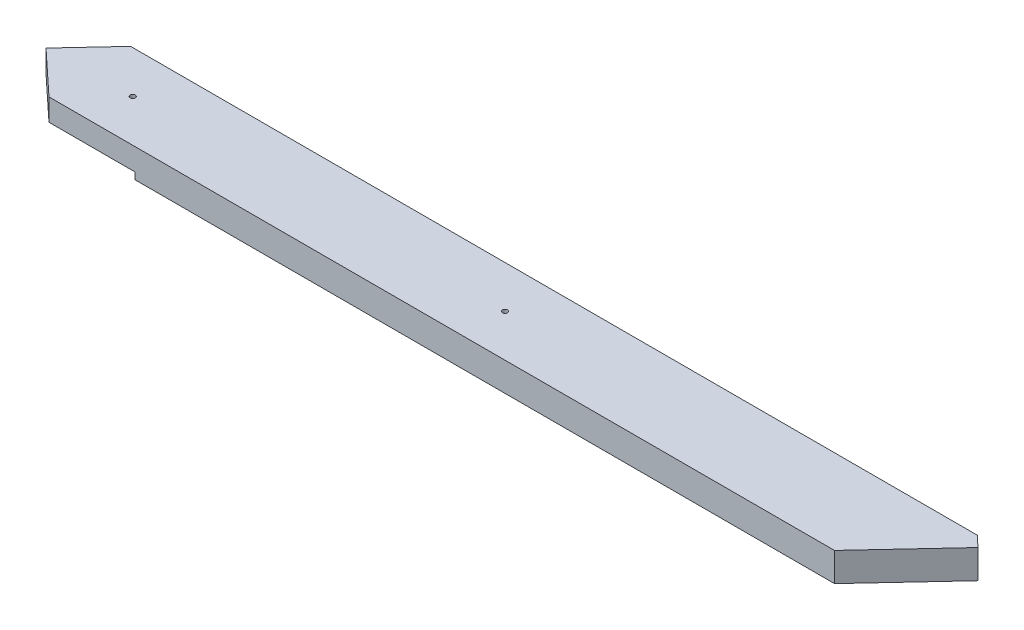
ISO-10303-21;
HEADER;
FILE_DESCRIPTION(('STEP AP214'),'2;1');
FILE_NAME('part.step','',(''),(''),'','','');
FILE_SCHEMA(('AUTOMOTIVE_DESIGN { 1 0 10303 214 1 1 1 1 }'));
ENDSEC;
DATA;
#1=APPLICATION_CONTEXT('core data for automotive mechanical design processes');
#2=APPLICATION_PROTOCOL_DEFINITION('international standard','automotive_design',2000,#1);
#3=PRODUCT_CONTEXT('',#1,'mechanical');
#4=PRODUCT('Part','Part','',(#3));
#5=PRODUCT_RELATED_PRODUCT_CATEGORY('part','',(#4));
#6=PRODUCT_DEFINITION_FORMATION('','',#4);
#7=PRODUCT_DEFINITION_CONTEXT('part definition',#1,'design');
#8=PRODUCT_DEFINITION('design','',#6,#7);
#9=PRODUCT_DEFINITION_SHAPE('','',#8);
#10=(LENGTH_UNIT() NAMED_UNIT(*) SI_UNIT(.MILLI.,.METRE.));
#11=(NAMED_UNIT(*) PLANE_ANGLE_UNIT() SI_UNIT($,.RADIAN.));
#12=(NAMED_UNIT(*) SI_UNIT($,.STERADIAN.) SOLID_ANGLE_UNIT());
#13=UNCERTAINTY_MEASURE_WITH_UNIT(LENGTH_MEASURE(1.E-05),#10,'distance_accuracy_value','');
#14=(GEOMETRIC_REPRESENTATION_CONTEXT(3) GLOBAL_UNCERTAINTY_ASSIGNED_CONTEXT((#13)) GLOBAL_UNIT_ASSIGNED_CONTEXT((#10,
#11,#12)) REPRESENTATION_CONTEXT('',''));
#15=CARTESIAN_POINT('',(0.,0.,0.));
#16=DIRECTION('',(0.,0.,1.));
#17=DIRECTION('',(1.,0.,0.));
#18=AXIS2_PLACEMENT_3D('',#15,#16,#17);
#19=CARTESIAN_POINT('',(-550.,34.,-50.));
#20=DIRECTION('',(0.,0.,1.));
#21=DIRECTION('',(1.,0.,0.));
#22=AXIS2_PLACEMENT_3D('',#19,#20,#21);
#23=PLANE('',#22);
#24=DIRECTION('',(-1.,0.,0.));
#25=VECTOR('',#24,1.);
#26=CARTESIAN_POINT('',(-550.,0.,-50.));
#27=LINE('',#26,#25);
#28=CARTESIAN_POINT('',(508.259057511825,0.,-50.));
#29=VERTEX_POINT('',#28);
#30=CARTESIAN_POINT('',(-294.288789872719,0.,-50.));
#31=VERTEX_POINT('',#30);
#32=EDGE_CURVE('E115',#29,#31,#27,.T.);
#33=ORIENTED_EDGE('',*,*,#32,.T.);
#34=DIRECTION('',(0.,1.,0.));
#35=VECTOR('',#34,1.);
#36=CARTESIAN_POINT('',(-294.288789872718,34.,-50.));
#37=LINE('',#36,#35);
#38=CARTESIAN_POINT('',(-294.288789872719,8.,-50.));
#39=VERTEX_POINT('',#38);
#40=EDGE_CURVE('E98',#31,#39,#37,.T.);
#41=ORIENTED_EDGE('',*,*,#40,.T.);
#42=DIRECTION('',(-1.,0.,0.));
#43=VECTOR('',#42,1.);
#44=CARTESIAN_POINT('',(-550.,8.,-50.));
#45=LINE('',#44,#43);
#46=CARTESIAN_POINT('',(-492.505745227102,8.,-50.));
#47=VERTEX_POINT('',#46);
#48=EDGE_CURVE('E166',#39,#47,#45,.T.);
#49=ORIENTED_EDGE('',*,*,#48,.T.);
#50=DIRECTION('',(0.,1.,0.));
#51=VECTOR('',#50,1.);
#52=CARTESIAN_POINT('',(-492.505745227102,0.,-50.));
#53=LINE('',#52,#51);
#54=CARTESIAN_POINT('',(-492.505745227102,34.,-50.));
#55=VERTEX_POINT('',#54);
#56=EDGE_CURVE('E149',#47,#55,#53,.T.);
#57=ORIENTED_EDGE('',*,*,#56,.T.);
#58=DIRECTION('',(-1.,0.,0.));
#59=VECTOR('',#58,1.);
#60=CARTESIAN_POINT('',(-550.,34.,-50.));
#61=LINE('',#60,#59);
#62=CARTESIAN_POINT('',(508.259057511825,34.,-50.));
#63=VERTEX_POINT('',#62);
#64=EDGE_CURVE('E123',#63,#55,#61,.T.);
#65=ORIENTED_EDGE('',*,*,#64,.F.);
#66=DIRECTION('',(0.,1.,0.));
#67=VECTOR('',#66,1.);
#68=CARTESIAN_POINT('',(508.259057511825,0.,-50.));
#69=LINE('',#68,#67);
#70=EDGE_CURVE('E120',#29,#63,#69,.T.);
#71=ORIENTED_EDGE('',*,*,#70,.F.);
#72=EDGE_LOOP('',(#33,#41,#49,#57,#65,#71));
#73=FACE_BOUND('',#72,.T.);
#74=ADVANCED_FACE('F33',(#73),#23,.F.);
#75=CARTESIAN_POINT('',(-550.,34.,50.));
#76=DIRECTION('',(0.,0.,-1.));
#77=DIRECTION('',(-1.,0.,0.));
#78=AXIS2_PLACEMENT_3D('',#75,#76,#77);
#79=PLANE('',#78);
#80=DIRECTION('',(1.,0.,0.));
#81=VECTOR('',#80,1.);
#82=CARTESIAN_POINT('',(-550.,8.,50.));
#83=LINE('',#82,#81);
#84=CARTESIAN_POINT('',(-489.02174353523,8.,50.));
#85=VERTEX_POINT('',#84);
#86=CARTESIAN_POINT('',(-387.494254772899,8.,50.));
#87=VERTEX_POINT('',#86);
#88=EDGE_CURVE('E47',#85,#87,#83,.T.);
#89=ORIENTED_EDGE('',*,*,#88,.T.);
#90=DIRECTION('',(0.,-1.,0.));
#91=VECTOR('',#90,1.);
#92=CARTESIAN_POINT('',(-387.494254772899,34.,50.));
#93=LINE('',#92,#91);
#94=CARTESIAN_POINT('',(-387.494254772899,0.,49.9999999999999));
#95=VERTEX_POINT('',#94);
#96=EDGE_CURVE('E108',#87,#95,#93,.T.);
#97=ORIENTED_EDGE('',*,*,#96,.T.);
#98=DIRECTION('',(1.,0.,0.));
#99=VECTOR('',#98,1.);
#100=CARTESIAN_POINT('',(-550.,0.,50.));
#101=LINE('',#100,#99);
#102=CARTESIAN_POINT('',(439.548903774699,0.,50.));
#103=VERTEX_POINT('',#102);
#104=EDGE_CURVE('E116',#95,#103,#101,.T.);
#105=ORIENTED_EDGE('',*,*,#104,.T.);
#106=DIRECTION('',(0.,1.,0.));
#107=VECTOR('',#106,1.);
#108=CARTESIAN_POINT('',(439.548903774699,0.,50.));
#109=LINE('',#108,#107);
#110=CARTESIAN_POINT('',(439.548903774699,34.,50.));
#111=VERTEX_POINT('',#110);
#112=EDGE_CURVE('E136',#103,#111,#109,.T.);
#113=ORIENTED_EDGE('',*,*,#112,.T.);
#114=DIRECTION('',(1.,0.,0.));
#115=VECTOR('',#114,1.);
#116=CARTESIAN_POINT('',(-550.,34.,50.));
#117=LINE('',#116,#115);
#118=CARTESIAN_POINT('',(-489.02174353523,34.,50.));
#119=VERTEX_POINT('',#118);
#120=EDGE_CURVE('E40',#119,#111,#117,.T.);
#121=ORIENTED_EDGE('',*,*,#120,.F.);
#122=DIRECTION('',(0.,1.,0.));
#123=VECTOR('',#122,1.);
#124=CARTESIAN_POINT('',(-489.02174353523,0.,50.));
#125=LINE('',#124,#123);
#126=EDGE_CURVE('E152',#85,#119,#125,.T.);
#127=ORIENTED_EDGE('',*,*,#126,.F.);
#128=EDGE_LOOP('',(#89,#97,#105,#113,#121,#127));
#129=FACE_BOUND('',#128,.T.);
#130=ADVANCED_FACE('F176',(#129),#79,.F.);
#131=CARTESIAN_POINT('',(0.,34.,0.));
#132=DIRECTION('',(0.,1.,0.));
#133=DIRECTION('',(0.,0.,1.));
#134=AXIS2_PLACEMENT_3D('',#131,#132,#133);
#135=PLANE('',#134);
#136=DIRECTION('',(0.681818181818181,0.,-0.73152167906505));
#137=VECTOR('',#136,1.);
#138=CARTESIAN_POINT('',(-540.762594459489,34.,1.77469935273535));
#139=LINE('',#138,#137);
#140=CARTESIAN_POINT('',(-540.762594459489,34.,1.77469935273535));
#141=VERTEX_POINT('',#140);
#142=EDGE_CURVE('E155',#141,#55,#139,.T.);
#143=ORIENTED_EDGE('',*,*,#142,.F.);
#144=DIRECTION('',(-0.73152167906505,0.,-0.681818181818181));
#145=VECTOR('',#144,1.);
#146=CARTESIAN_POINT('',(-489.02174353523,34.,50.));
#147=LINE('',#146,#145);
#148=EDGE_CURVE('E107',#119,#141,#147,.T.);
#149=ORIENTED_EDGE('',*,*,#148,.F.);
#150=ORIENTED_EDGE('',*,*,#120,.T.);
#151=DIRECTION('',(-0.681818181818182,0.,0.731521679065049));
#152=VECTOR('',#151,1.);
#153=CARTESIAN_POINT('',(439.548903774699,34.,50.));
#154=LINE('',#153,#152);
#155=CARTESIAN_POINT('',(521.36708559288,34.,-37.7826014878059));
#156=VERTEX_POINT('',#155);
#157=EDGE_CURVE('E142',#156,#111,#154,.T.);
#158=ORIENTED_EDGE('',*,*,#157,.F.);
#159=DIRECTION('',(0.73152167906505,0.,0.681818181818181));
#160=VECTOR('',#159,1.);
#161=CARTESIAN_POINT('',(521.36708559288,34.,-37.7826014878059));
#162=LINE('',#161,#160);
#163=EDGE_CURVE('E146',#63,#156,#162,.T.);
#164=ORIENTED_EDGE('',*,*,#163,.F.);
#165=ORIENTED_EDGE('',*,*,#64,.T.);
#166=EDGE_LOOP('',(#143,#149,#150,#158,#164,#165));
#167=FACE_BOUND('',#166,.T.);
#168=CARTESIAN_POINT('',(-440.,34.,0.));
#169=DIRECTION('',(0.,-1.,0.));
#170=DIRECTION('',(0.,0.,-1.));
#171=AXIS2_PLACEMENT_3D('',#168,#169,#170);
#172=CIRCLE('',#171,3.);
#173=CARTESIAN_POINT('',(-440.,34.,-3.));
#174=VERTEX_POINT('',#173);
#175=EDGE_CURVE('E132',#174,#174,#172,.T.);
#176=ORIENTED_EDGE('',*,*,#175,.T.);
#177=EDGE_LOOP('',(#176));
#178=FACE_BOUND('',#177,.T.);
#179=CARTESIAN_POINT('',(0.,34.,0.));
#180=DIRECTION('',(0.,-1.,0.));
#181=DIRECTION('',(0.,0.,-1.));
#182=AXIS2_PLACEMENT_3D('',#179,#180,#181);
#183=CIRCLE('',#182,3.);
#184=CARTESIAN_POINT('',(0.,34.,-3.));
#185=VERTEX_POINT('',#184);
#186=EDGE_CURVE('E121',#185,#185,#183,.T.);
#187=ORIENTED_EDGE('',*,*,#186,.T.);
#188=EDGE_LOOP('',(#187));
#189=FACE_BOUND('',#188,.T.);
#190=ADVANCED_FACE('F184',(#167,#178,#189),#135,.T.);
#191=CARTESIAN_POINT('',(0.,0.,0.));
#192=DIRECTION('',(0.,1.,0.));
#193=DIRECTION('',(0.,0.,1.));
#194=AXIS2_PLACEMENT_3D('',#191,#192,#193);
#195=PLANE('',#194);
#196=CARTESIAN_POINT('',(0.,0.,0.));
#197=DIRECTION('',(0.,-1.,0.));
#198=DIRECTION('',(0.,0.,-1.));
#199=AXIS2_PLACEMENT_3D('',#196,#197,#198);
#200=CIRCLE('',#199,3.);
#201=CARTESIAN_POINT('',(0.,0.,-3.));
#202=VERTEX_POINT('',#201);
#203=EDGE_CURVE('E125',#202,#202,#200,.T.);
#204=ORIENTED_EDGE('',*,*,#203,.F.);
#205=EDGE_LOOP('',(#204));
#206=FACE_BOUND('',#205,.T.);
#207=ORIENTED_EDGE('',*,*,#104,.F.);
#208=DIRECTION('',(-0.681818181818182,0.,0.731521679065049));
#209=VECTOR('',#208,1.);
#210=CARTESIAN_POINT('',(-122.999320006202,0.,-233.776208884277));
#211=LINE('',#210,#209);
#212=EDGE_CURVE('E101',#31,#95,#211,.T.);
#213=ORIENTED_EDGE('',*,*,#212,.F.);
#214=ORIENTED_EDGE('',*,*,#32,.F.);
#215=DIRECTION('',(0.73152167906505,0.,0.681818181818181));
#216=VECTOR('',#215,1.);
#217=CARTESIAN_POINT('',(521.36708559288,0.,-37.7826014878059));
#218=LINE('',#217,#216);
#219=CARTESIAN_POINT('',(521.36708559288,0.,-37.7826014878059));
#220=VERTEX_POINT('',#219);
#221=EDGE_CURVE('E145',#29,#220,#218,.T.);
#222=ORIENTED_EDGE('',*,*,#221,.T.);
#223=DIRECTION('',(-0.681818181818182,0.,0.731521679065049));
#224=VECTOR('',#223,1.);
#225=CARTESIAN_POINT('',(439.548903774699,0.,50.));
#226=LINE('',#225,#224);
#227=EDGE_CURVE('E54',#220,#103,#226,.T.);
#228=ORIENTED_EDGE('',*,*,#227,.T.);
#229=EDGE_LOOP('',(#207,#213,#214,#222,#228));
#230=FACE_BOUND('',#229,.T.);
#231=ADVANCED_FACE('F113',(#206,#230),#195,.F.);
#232=CARTESIAN_POINT('',(0.,34.,0.));
#233=DIRECTION('',(0.,-1.,0.));
#234=DIRECTION('',(0.,0.,-1.));
#235=AXIS2_PLACEMENT_3D('',#232,#233,#234);
#236=CYLINDRICAL_SURFACE('',#235,3.);
#237=ORIENTED_EDGE('',*,*,#186,.F.);
#238=EDGE_LOOP('',(#237));
#239=FACE_BOUND('',#238,.T.);
#240=ORIENTED_EDGE('',*,*,#203,.T.);
#241=EDGE_LOOP('',(#240));
#242=FACE_BOUND('',#241,.T.);
#243=ADVANCED_FACE('F213',(#239,#242),#236,.F.);
#244=CARTESIAN_POINT('',(-440.,34.,0.));
#245=DIRECTION('',(0.,-1.,0.));
#246=DIRECTION('',(0.,0.,-1.));
#247=AXIS2_PLACEMENT_3D('',#244,#245,#246);
#248=CYLINDRICAL_SURFACE('',#247,3.);
#249=CARTESIAN_POINT('',(-440.,8.,0.));
#250=DIRECTION('',(0.,1.,0.));
#251=DIRECTION('',(0.,0.,1.));
#252=AXIS2_PLACEMENT_3D('',#249,#250,#251);
#253=CIRCLE('',#252,3.);
#254=CARTESIAN_POINT('',(-440.,8.,3.));
#255=VERTEX_POINT('',#254);
#256=EDGE_CURVE('E163',#255,#255,#253,.F.);
#257=ORIENTED_EDGE('',*,*,#256,.T.);
#258=EDGE_LOOP('',(#257));
#259=FACE_BOUND('',#258,.T.);
#260=ORIENTED_EDGE('',*,*,#175,.F.);
#261=EDGE_LOOP('',(#260));
#262=FACE_BOUND('',#261,.T.);
#263=ADVANCED_FACE('F218',(#259,#262),#248,.F.);
#264=CARTESIAN_POINT('',(439.548903774699,0.,50.));
#265=DIRECTION('',(-0.73152167906505,0.,-0.681818181818182));
#266=DIRECTION('',(-0.681818181818182,0.,0.73152167906505));
#267=AXIS2_PLACEMENT_3D('',#264,#265,#266);
#268=PLANE('',#267);
#269=ORIENTED_EDGE('',*,*,#157,.T.);
#270=ORIENTED_EDGE('',*,*,#112,.F.);
#271=ORIENTED_EDGE('',*,*,#227,.F.);
#272=DIRECTION('',(0.,1.,0.));
#273=VECTOR('',#272,1.);
#274=CARTESIAN_POINT('',(521.36708559288,0.,-37.7826014878059));
#275=LINE('',#274,#273);
#276=EDGE_CURVE('E138',#220,#156,#275,.T.);
#277=ORIENTED_EDGE('',*,*,#276,.T.);
#278=EDGE_LOOP('',(#269,#270,#271,#277));
#279=FACE_BOUND('',#278,.T.);
#280=ADVANCED_FACE('F199',(#279),#268,.F.);
#281=CARTESIAN_POINT('',(521.36708559288,0.,-37.7826014878059));
#282=DIRECTION('',(-0.681818181818181,0.,0.73152167906505));
#283=DIRECTION('',(0.73152167906505,0.,0.681818181818181));
#284=AXIS2_PLACEMENT_3D('',#281,#282,#283);
#285=PLANE('',#284);
#286=ORIENTED_EDGE('',*,*,#163,.T.);
#287=ORIENTED_EDGE('',*,*,#276,.F.);
#288=ORIENTED_EDGE('',*,*,#221,.F.);
#289=ORIENTED_EDGE('',*,*,#70,.T.);
#290=EDGE_LOOP('',(#286,#287,#288,#289));
#291=FACE_BOUND('',#290,.T.);
#292=ADVANCED_FACE('F192',(#291),#285,.F.);
#293=CARTESIAN_POINT('',(-540.762594459489,0.,1.77469935273535));
#294=DIRECTION('',(0.73152167906505,0.,0.681818181818181));
#295=DIRECTION('',(0.681818181818181,0.,-0.73152167906505));
#296=AXIS2_PLACEMENT_3D('',#293,#294,#295);
#297=PLANE('',#296);
#298=ORIENTED_EDGE('',*,*,#56,.F.);
#299=DIRECTION('',(-0.681818181818181,0.,0.73152167906505));
#300=VECTOR('',#299,1.);
#301=CARTESIAN_POINT('',(-540.762594459489,8.,1.77469935273535));
#302=LINE('',#301,#300);
#303=CARTESIAN_POINT('',(-540.762594459489,8.,1.77469935273533));
#304=VERTEX_POINT('',#303);
#305=EDGE_CURVE('E169',#47,#304,#302,.T.);
#306=ORIENTED_EDGE('',*,*,#305,.T.);
#307=DIRECTION('',(0.,1.,0.));
#308=VECTOR('',#307,1.);
#309=CARTESIAN_POINT('',(-540.762594459489,0.,1.77469935273535));
#310=LINE('',#309,#308);
#311=EDGE_CURVE('E154',#304,#141,#310,.T.);
#312=ORIENTED_EDGE('',*,*,#311,.T.);
#313=ORIENTED_EDGE('',*,*,#142,.T.);
#314=EDGE_LOOP('',(#298,#306,#312,#313));
#315=FACE_BOUND('',#314,.T.);
#316=ADVANCED_FACE('F190',(#315),#297,.F.);
#317=CARTESIAN_POINT('',(-489.02174353523,0.,50.));
#318=DIRECTION('',(0.681818181818181,0.,-0.73152167906505));
#319=DIRECTION('',(-0.73152167906505,0.,-0.681818181818181));
#320=AXIS2_PLACEMENT_3D('',#317,#318,#319);
#321=PLANE('',#320);
#322=ORIENTED_EDGE('',*,*,#311,.F.);
#323=DIRECTION('',(0.73152167906505,0.,0.681818181818181));
#324=VECTOR('',#323,1.);
#325=CARTESIAN_POINT('',(-489.02174353523,8.,50.));
#326=LINE('',#325,#324);
#327=EDGE_CURVE('E11',#304,#85,#326,.T.);
#328=ORIENTED_EDGE('',*,*,#327,.T.);
#329=ORIENTED_EDGE('',*,*,#126,.T.);
#330=ORIENTED_EDGE('',*,*,#148,.T.);
#331=EDGE_LOOP('',(#322,#328,#329,#330));
#332=FACE_BOUND('',#331,.T.);
#333=ADVANCED_FACE('F181',(#332),#321,.F.);
#334=CARTESIAN_POINT('',(-122.999320006202,8.,-233.776208884277));
#335=DIRECTION('',(0.731521679065049,0.,0.681818181818182));
#336=DIRECTION('',(0.681818181818182,0.,-0.731521679065049));
#337=AXIS2_PLACEMENT_3D('',#334,#335,#336);
#338=PLANE('',#337);
#339=ORIENTED_EDGE('',*,*,#212,.T.);
#340=ORIENTED_EDGE('',*,*,#96,.F.);
#341=DIRECTION('',(-0.681818181818182,0.,0.731521679065049));
#342=VECTOR('',#341,1.);
#343=CARTESIAN_POINT('',(-122.999320006202,8.,-233.776208884277));
#344=LINE('',#343,#342);
#345=EDGE_CURVE('E103',#39,#87,#344,.T.);
#346=ORIENTED_EDGE('',*,*,#345,.F.);
#347=ORIENTED_EDGE('',*,*,#40,.F.);
#348=EDGE_LOOP('',(#339,#340,#346,#347));
#349=FACE_BOUND('',#348,.T.);
#350=ADVANCED_FACE('F100',(#349),#338,.F.);
#351=CARTESIAN_POINT('',(0.,8.,0.));
#352=DIRECTION('',(0.,1.,0.));
#353=DIRECTION('',(0.,0.,1.));
#354=AXIS2_PLACEMENT_3D('',#351,#352,#353);
#355=PLANE('',#354);
#356=ORIENTED_EDGE('',*,*,#345,.T.);
#357=ORIENTED_EDGE('',*,*,#88,.F.);
#358=ORIENTED_EDGE('',*,*,#327,.F.);
#359=ORIENTED_EDGE('',*,*,#305,.F.);
#360=ORIENTED_EDGE('',*,*,#48,.F.);
#361=EDGE_LOOP('',(#356,#357,#358,#359,#360));
#362=FACE_BOUND('',#361,.T.);
#363=ORIENTED_EDGE('',*,*,#256,.F.);
#364=EDGE_LOOP('',(#363));
#365=FACE_BOUND('',#364,.T.);
#366=ADVANCED_FACE('F172',(#362,#365),#355,.F.);
#367=CLOSED_SHELL('',(#74,#130,#190,#231,#243,#263,#280,#292,#316,#333,#350,#366));
#368=MANIFOLD_SOLID_BREP('B2',#367);
#369=ADVANCED_BREP_SHAPE_REPRESENTATION('',(#18,#368),#14);
#370=SHAPE_DEFINITION_REPRESENTATION(#9,#369);
ENDSEC;
END-ISO-10303-21;
